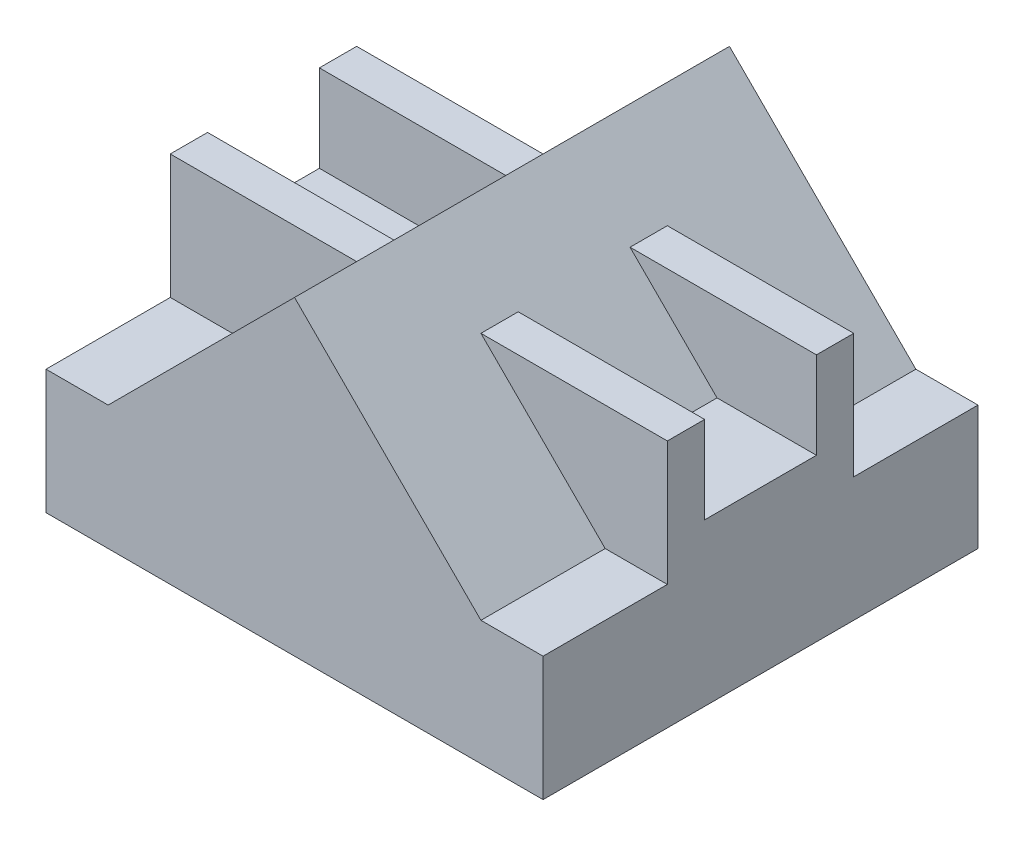
ISO-10303-21;
HEADER;
FILE_DESCRIPTION(('STEP AP214'),'2;1');
FILE_NAME('part.step','',(''),(''),'','','');
FILE_SCHEMA(('AUTOMOTIVE_DESIGN { 1 0 10303 214 1 1 1 1 }'));
ENDSEC;
DATA;
#1=APPLICATION_CONTEXT('core data for automotive mechanical design processes');
#2=APPLICATION_PROTOCOL_DEFINITION('international standard','automotive_design',2000,#1);
#3=PRODUCT_CONTEXT('',#1,'mechanical');
#4=PRODUCT('Part','Part','',(#3));
#5=PRODUCT_RELATED_PRODUCT_CATEGORY('part','',(#4));
#6=PRODUCT_DEFINITION_FORMATION('','',#4);
#7=PRODUCT_DEFINITION_CONTEXT('part definition',#1,'design');
#8=PRODUCT_DEFINITION('design','',#6,#7);
#9=PRODUCT_DEFINITION_SHAPE('','',#8);
#10=(LENGTH_UNIT() NAMED_UNIT(*) SI_UNIT(.MILLI.,.METRE.));
#11=(NAMED_UNIT(*) PLANE_ANGLE_UNIT() SI_UNIT($,.RADIAN.));
#12=(NAMED_UNIT(*) SI_UNIT($,.STERADIAN.) SOLID_ANGLE_UNIT());
#13=UNCERTAINTY_MEASURE_WITH_UNIT(LENGTH_MEASURE(1.E-05),#10,'distance_accuracy_value','');
#14=(GEOMETRIC_REPRESENTATION_CONTEXT(3) GLOBAL_UNCERTAINTY_ASSIGNED_CONTEXT((#13)) GLOBAL_UNIT_ASSIGNED_CONTEXT((#10,
#11,#12)) REPRESENTATION_CONTEXT('',''));
#15=CARTESIAN_POINT('',(0.,0.,0.));
#16=DIRECTION('',(0.,0.,1.));
#17=DIRECTION('',(1.,0.,0.));
#18=AXIS2_PLACEMENT_3D('',#15,#16,#17);
#19=CARTESIAN_POINT('',(-100.,100.,87.5));
#20=DIRECTION('',(1.,0.,0.));
#21=DIRECTION('',(0.,1.,0.));
#22=AXIS2_PLACEMENT_3D('',#19,#20,#21);
#23=PLANE('',#22);
#24=DIRECTION('',(0.,-1.,0.));
#25=VECTOR('',#24,1.);
#26=CARTESIAN_POINT('',(-100.,100.,37.5));
#27=LINE('',#26,#25);
#28=CARTESIAN_POINT('',(-100.,100.,37.5));
#29=VERTEX_POINT('',#28);
#30=CARTESIAN_POINT('',(-100.,50.,37.5));
#31=VERTEX_POINT('',#30);
#32=EDGE_CURVE('E233',#29,#31,#27,.T.);
#33=ORIENTED_EDGE('',*,*,#32,.F.);
#34=DIRECTION('',(0.,0.,-1.));
#35=VECTOR('',#34,1.);
#36=CARTESIAN_POINT('',(-100.,100.,87.5));
#37=LINE('',#36,#35);
#38=CARTESIAN_POINT('',(-100.,100.,22.5));
#39=VERTEX_POINT('',#38);
#40=EDGE_CURVE('E405',#29,#39,#37,.T.);
#41=ORIENTED_EDGE('',*,*,#40,.T.);
#42=DIRECTION('',(0.,1.,0.));
#43=VECTOR('',#42,1.);
#44=CARTESIAN_POINT('',(-100.,65.,22.5));
#45=LINE('',#44,#43);
#46=CARTESIAN_POINT('',(-100.,65.,22.5));
#47=VERTEX_POINT('',#46);
#48=EDGE_CURVE('E226',#47,#39,#45,.T.);
#49=ORIENTED_EDGE('',*,*,#48,.F.);
#50=DIRECTION('',(0.,0.,1.));
#51=VECTOR('',#50,1.);
#52=CARTESIAN_POINT('',(-100.,65.,-22.5));
#53=LINE('',#52,#51);
#54=CARTESIAN_POINT('',(-100.,65.,-22.5));
#55=VERTEX_POINT('',#54);
#56=EDGE_CURVE('E206',#55,#47,#53,.T.);
#57=ORIENTED_EDGE('',*,*,#56,.F.);
#58=DIRECTION('',(0.,-1.,0.));
#59=VECTOR('',#58,1.);
#60=CARTESIAN_POINT('',(-100.,100.,-22.5));
#61=LINE('',#60,#59);
#62=CARTESIAN_POINT('',(-100.,100.,-22.5));
#63=VERTEX_POINT('',#62);
#64=EDGE_CURVE('E214',#63,#55,#61,.T.);
#65=ORIENTED_EDGE('',*,*,#64,.F.);
#66=CARTESIAN_POINT('',(-100.,100.,-37.5));
#67=VERTEX_POINT('',#66);
#68=EDGE_CURVE('E384',#63,#67,#37,.T.);
#69=ORIENTED_EDGE('',*,*,#68,.T.);
#70=DIRECTION('',(0.,1.,0.));
#71=VECTOR('',#70,1.);
#72=CARTESIAN_POINT('',(-100.,50.,-37.5));
#73=LINE('',#72,#71);
#74=CARTESIAN_POINT('',(-100.,50.,-37.5));
#75=VERTEX_POINT('',#74);
#76=EDGE_CURVE('E224',#75,#67,#73,.T.);
#77=ORIENTED_EDGE('',*,*,#76,.F.);
#78=DIRECTION('',(0.,0.,1.));
#79=VECTOR('',#78,1.);
#80=CARTESIAN_POINT('',(-100.,50.,-87.5));
#81=LINE('',#80,#79);
#82=CARTESIAN_POINT('',(-100.,50.,-87.5));
#83=VERTEX_POINT('',#82);
#84=EDGE_CURVE('E451',#83,#75,#81,.T.);
#85=ORIENTED_EDGE('',*,*,#84,.F.);
#86=DIRECTION('',(0.,-1.,0.));
#87=VECTOR('',#86,1.);
#88=CARTESIAN_POINT('',(-100.,100.,-87.5));
#89=LINE('',#88,#87);
#90=CARTESIAN_POINT('',(-100.,0.,-87.5));
#91=VERTEX_POINT('',#90);
#92=EDGE_CURVE('E350',#83,#91,#89,.T.);
#93=ORIENTED_EDGE('',*,*,#92,.T.);
#94=DIRECTION('',(0.,0.,-1.));
#95=VECTOR('',#94,1.);
#96=CARTESIAN_POINT('',(-100.,0.,87.5));
#97=LINE('',#96,#95);
#98=CARTESIAN_POINT('',(-100.,0.,87.5));
#99=VERTEX_POINT('',#98);
#100=EDGE_CURVE('E11',#99,#91,#97,.T.);
#101=ORIENTED_EDGE('',*,*,#100,.F.);
#102=DIRECTION('',(0.,-1.,0.));
#103=VECTOR('',#102,1.);
#104=CARTESIAN_POINT('',(-100.,100.,87.5));
#105=LINE('',#104,#103);
#106=CARTESIAN_POINT('',(-100.,50.,87.5));
#107=VERTEX_POINT('',#106);
#108=EDGE_CURVE('E366',#107,#99,#105,.T.);
#109=ORIENTED_EDGE('',*,*,#108,.F.);
#110=DIRECTION('',(0.,0.,1.));
#111=VECTOR('',#110,1.);
#112=CARTESIAN_POINT('',(-100.,50.,37.5));
#113=LINE('',#112,#111);
#114=EDGE_CURVE('E460',#31,#107,#113,.T.);
#115=ORIENTED_EDGE('',*,*,#114,.F.);
#116=EDGE_LOOP('',(#33,#41,#49,#57,#65,#69,#77,#85,#93,#101,#109,#115));
#117=FACE_BOUND('',#116,.T.);
#118=ADVANCED_FACE('F44',(#117),#23,.F.);
#119=CARTESIAN_POINT('',(-24.9999999999999,100.,87.5));
#120=DIRECTION('',(0.,-1.,0.));
#121=DIRECTION('',(1.,0.,0.));
#122=AXIS2_PLACEMENT_3D('',#119,#120,#121);
#123=PLANE('',#122);
#124=DIRECTION('',(0.,0.,-1.));
#125=VECTOR('',#124,1.);
#126=CARTESIAN_POINT('',(-24.9999999999999,100.,87.5));
#127=LINE('',#126,#125);
#128=CARTESIAN_POINT('',(-24.9999999999999,100.,37.5));
#129=VERTEX_POINT('',#128);
#130=CARTESIAN_POINT('',(-24.9999999999999,100.,22.5));
#131=VERTEX_POINT('',#130);
#132=EDGE_CURVE('E406',#129,#131,#127,.T.);
#133=ORIENTED_EDGE('',*,*,#132,.T.);
#134=DIRECTION('',(-1.,0.,0.));
#135=VECTOR('',#134,1.);
#136=CARTESIAN_POINT('',(192.326284001661,100.,22.5));
#137=LINE('',#136,#135);
#138=EDGE_CURVE('E240',#131,#39,#137,.T.);
#139=ORIENTED_EDGE('',*,*,#138,.T.);
#140=ORIENTED_EDGE('',*,*,#40,.F.);
#141=DIRECTION('',(-1.,0.,0.));
#142=VECTOR('',#141,1.);
#143=CARTESIAN_POINT('',(192.326284001661,100.,37.5));
#144=LINE('',#143,#142);
#145=EDGE_CURVE('E257',#129,#29,#144,.T.);
#146=ORIENTED_EDGE('',*,*,#145,.F.);
#147=EDGE_LOOP('',(#133,#139,#140,#146));
#148=FACE_BOUND('',#147,.T.);
#149=ADVANCED_FACE('F485',(#148),#123,.F.);
#150=CARTESIAN_POINT('',(-24.9999999999999,100.,-22.5));
#151=VERTEX_POINT('',#150);
#152=CARTESIAN_POINT('',(-24.9999999999999,100.,-37.5));
#153=VERTEX_POINT('',#152);
#154=EDGE_CURVE('E401',#151,#153,#127,.T.);
#155=ORIENTED_EDGE('',*,*,#154,.T.);
#156=DIRECTION('',(-1.,0.,0.));
#157=VECTOR('',#156,1.);
#158=CARTESIAN_POINT('',(192.326284001661,100.,-37.5));
#159=LINE('',#158,#157);
#160=EDGE_CURVE('E242',#153,#67,#159,.T.);
#161=ORIENTED_EDGE('',*,*,#160,.T.);
#162=ORIENTED_EDGE('',*,*,#68,.F.);
#163=DIRECTION('',(-1.,0.,0.));
#164=VECTOR('',#163,1.);
#165=CARTESIAN_POINT('',(192.326284001661,100.,-22.5));
#166=LINE('',#165,#164);
#167=EDGE_CURVE('E217',#151,#63,#166,.T.);
#168=ORIENTED_EDGE('',*,*,#167,.F.);
#169=EDGE_LOOP('',(#155,#161,#162,#168));
#170=FACE_BOUND('',#169,.T.);
#171=ADVANCED_FACE('F486',(#170),#123,.F.);
#172=CARTESIAN_POINT('',(0.,0.,87.5));
#173=DIRECTION('',(0.,0.,1.));
#174=DIRECTION('',(1.,0.,0.));
#175=AXIS2_PLACEMENT_3D('',#172,#173,#174);
#176=PLANE('',#175);
#177=DIRECTION('',(-0.707106781186546,-0.707106781186549,0.));
#178=VECTOR('',#177,1.);
#179=CARTESIAN_POINT('',(0.,125.,87.5));
#180=LINE('',#179,#178);
#181=CARTESIAN_POINT('',(0.,125.,87.5));
#182=VERTEX_POINT('',#181);
#183=CARTESIAN_POINT('',(-74.9999999999997,50.,87.5));
#184=VERTEX_POINT('',#183);
#185=EDGE_CURVE('E385',#182,#184,#180,.T.);
#186=ORIENTED_EDGE('',*,*,#185,.T.);
#187=DIRECTION('',(-1.,0.,0.));
#188=VECTOR('',#187,1.);
#189=CARTESIAN_POINT('',(192.326284001661,50.,87.5));
#190=LINE('',#189,#188);
#191=EDGE_CURVE('E254',#184,#107,#190,.T.);
#192=ORIENTED_EDGE('',*,*,#191,.T.);
#193=ORIENTED_EDGE('',*,*,#108,.T.);
#194=DIRECTION('',(1.,0.,0.));
#195=VECTOR('',#194,1.);
#196=CARTESIAN_POINT('',(-100.,0.,87.5));
#197=LINE('',#196,#195);
#198=CARTESIAN_POINT('',(100.,0.,87.5));
#199=VERTEX_POINT('',#198);
#200=EDGE_CURVE('E371',#99,#199,#197,.T.);
#201=ORIENTED_EDGE('',*,*,#200,.T.);
#202=DIRECTION('',(0.,1.,0.));
#203=VECTOR('',#202,1.);
#204=CARTESIAN_POINT('',(100.,0.,87.5));
#205=LINE('',#204,#203);
#206=CARTESIAN_POINT('',(100.,50.,87.5));
#207=VERTEX_POINT('',#206);
#208=EDGE_CURVE('E374',#199,#207,#205,.T.);
#209=ORIENTED_EDGE('',*,*,#208,.T.);
#210=DIRECTION('',(1.,0.,0.));
#211=VECTOR('',#210,1.);
#212=CARTESIAN_POINT('',(-192.326284001661,50.,87.5));
#213=LINE('',#212,#211);
#214=CARTESIAN_POINT('',(74.9999999999997,50.,87.5));
#215=VERTEX_POINT('',#214);
#216=EDGE_CURVE('E290',#215,#207,#213,.T.);
#217=ORIENTED_EDGE('',*,*,#216,.F.);
#218=DIRECTION('',(-0.707106781186546,0.707106781186549,0.));
#219=VECTOR('',#218,1.);
#220=CARTESIAN_POINT('',(24.9999999999999,100.,87.5));
#221=LINE('',#220,#219);
#222=EDGE_CURVE('E377',#215,#182,#221,.T.);
#223=ORIENTED_EDGE('',*,*,#222,.T.);
#224=EDGE_LOOP('',(#186,#192,#193,#201,#209,#217,#223));
#225=FACE_BOUND('',#224,.T.);
#226=ADVANCED_FACE('F475',(#225),#176,.T.);
#227=CARTESIAN_POINT('',(0.,0.,-87.5));
#228=DIRECTION('',(0.,0.,1.));
#229=DIRECTION('',(1.,0.,0.));
#230=AXIS2_PLACEMENT_3D('',#227,#228,#229);
#231=PLANE('',#230);
#232=DIRECTION('',(-1.,0.,0.));
#233=VECTOR('',#232,1.);
#234=CARTESIAN_POINT('',(192.326284001661,50.,-87.5));
#235=LINE('',#234,#233);
#236=CARTESIAN_POINT('',(-74.9999999999997,50.,-87.5));
#237=VERTEX_POINT('',#236);
#238=EDGE_CURVE('E249',#237,#83,#235,.T.);
#239=ORIENTED_EDGE('',*,*,#238,.F.);
#240=DIRECTION('',(-0.707106781186546,-0.707106781186549,0.));
#241=VECTOR('',#240,1.);
#242=CARTESIAN_POINT('',(0.,125.,-87.5));
#243=LINE('',#242,#241);
#244=CARTESIAN_POINT('',(0.,125.,-87.5));
#245=VERTEX_POINT('',#244);
#246=EDGE_CURVE('E375',#245,#237,#243,.T.);
#247=ORIENTED_EDGE('',*,*,#246,.F.);
#248=DIRECTION('',(-0.707106781186546,0.707106781186549,0.));
#249=VECTOR('',#248,1.);
#250=CARTESIAN_POINT('',(24.9999999999999,100.,-87.5));
#251=LINE('',#250,#249);
#252=CARTESIAN_POINT('',(74.9999999999997,50.,-87.5));
#253=VERTEX_POINT('',#252);
#254=EDGE_CURVE('E392',#253,#245,#251,.T.);
#255=ORIENTED_EDGE('',*,*,#254,.F.);
#256=DIRECTION('',(1.,0.,0.));
#257=VECTOR('',#256,1.);
#258=CARTESIAN_POINT('',(-192.326284001661,50.,-87.5));
#259=LINE('',#258,#257);
#260=CARTESIAN_POINT('',(100.,50.,-87.5));
#261=VERTEX_POINT('',#260);
#262=EDGE_CURVE('E311',#253,#261,#259,.T.);
#263=ORIENTED_EDGE('',*,*,#262,.T.);
#264=DIRECTION('',(0.,1.,0.));
#265=VECTOR('',#264,1.);
#266=CARTESIAN_POINT('',(100.,0.,-87.5));
#267=LINE('',#266,#265);
#268=CARTESIAN_POINT('',(100.,0.,-87.5));
#269=VERTEX_POINT('',#268);
#270=EDGE_CURVE('E394',#269,#261,#267,.T.);
#271=ORIENTED_EDGE('',*,*,#270,.F.);
#272=DIRECTION('',(1.,0.,0.));
#273=VECTOR('',#272,1.);
#274=CARTESIAN_POINT('',(-100.,0.,-87.5));
#275=LINE('',#274,#273);
#276=EDGE_CURVE('E389',#91,#269,#275,.T.);
#277=ORIENTED_EDGE('',*,*,#276,.F.);
#278=ORIENTED_EDGE('',*,*,#92,.F.);
#279=EDGE_LOOP('',(#239,#247,#255,#263,#271,#277,#278));
#280=FACE_BOUND('',#279,.T.);
#281=ADVANCED_FACE('F499',(#280),#231,.F.);
#282=CARTESIAN_POINT('',(100.,0.,87.5));
#283=DIRECTION('',(-1.,0.,0.));
#284=DIRECTION('',(0.,-1.,0.));
#285=AXIS2_PLACEMENT_3D('',#282,#283,#284);
#286=PLANE('',#285);
#287=DIRECTION('',(0.,0.,-1.));
#288=VECTOR('',#287,1.);
#289=CARTESIAN_POINT('',(100.,50.,87.5));
#290=LINE('',#289,#288);
#291=CARTESIAN_POINT('',(100.,50.,37.5));
#292=VERTEX_POINT('',#291);
#293=EDGE_CURVE('E285',#207,#292,#290,.T.);
#294=ORIENTED_EDGE('',*,*,#293,.F.);
#295=ORIENTED_EDGE('',*,*,#208,.F.);
#296=DIRECTION('',(0.,0.,-1.));
#297=VECTOR('',#296,1.);
#298=CARTESIAN_POINT('',(100.,0.,87.5));
#299=LINE('',#298,#297);
#300=EDGE_CURVE('E52',#199,#269,#299,.T.);
#301=ORIENTED_EDGE('',*,*,#300,.T.);
#302=ORIENTED_EDGE('',*,*,#270,.T.);
#303=DIRECTION('',(0.,0.,-1.));
#304=VECTOR('',#303,1.);
#305=CARTESIAN_POINT('',(100.,50.,-37.5));
#306=LINE('',#305,#304);
#307=CARTESIAN_POINT('',(100.,50.,-37.5));
#308=VERTEX_POINT('',#307);
#309=EDGE_CURVE('E283',#308,#261,#306,.T.);
#310=ORIENTED_EDGE('',*,*,#309,.F.);
#311=DIRECTION('',(0.,-1.,0.));
#312=VECTOR('',#311,1.);
#313=CARTESIAN_POINT('',(100.,100.,-37.5));
#314=LINE('',#313,#312);
#315=CARTESIAN_POINT('',(100.,100.,-37.5));
#316=VERTEX_POINT('',#315);
#317=EDGE_CURVE('E286',#316,#308,#314,.T.);
#318=ORIENTED_EDGE('',*,*,#317,.F.);
#319=DIRECTION('',(0.,0.,-1.));
#320=VECTOR('',#319,1.);
#321=CARTESIAN_POINT('',(100.,100.,87.5));
#322=LINE('',#321,#320);
#323=CARTESIAN_POINT('',(100.,100.,-22.5));
#324=VERTEX_POINT('',#323);
#325=EDGE_CURVE('E417',#324,#316,#322,.T.);
#326=ORIENTED_EDGE('',*,*,#325,.F.);
#327=DIRECTION('',(0.,1.,0.));
#328=VECTOR('',#327,1.);
#329=CARTESIAN_POINT('',(100.,65.,-22.5));
#330=LINE('',#329,#328);
#331=CARTESIAN_POINT('',(100.,65.,-22.5));
#332=VERTEX_POINT('',#331);
#333=EDGE_CURVE('E295',#332,#324,#330,.T.);
#334=ORIENTED_EDGE('',*,*,#333,.F.);
#335=DIRECTION('',(0.,0.,-1.));
#336=VECTOR('',#335,1.);
#337=CARTESIAN_POINT('',(100.,65.,22.5));
#338=LINE('',#337,#336);
#339=CARTESIAN_POINT('',(100.,65.,22.5));
#340=VERTEX_POINT('',#339);
#341=EDGE_CURVE('E293',#340,#332,#338,.T.);
#342=ORIENTED_EDGE('',*,*,#341,.F.);
#343=DIRECTION('',(0.,-1.,0.));
#344=VECTOR('',#343,1.);
#345=CARTESIAN_POINT('',(100.,100.,22.5));
#346=LINE('',#345,#344);
#347=CARTESIAN_POINT('',(100.,100.,22.5));
#348=VERTEX_POINT('',#347);
#349=EDGE_CURVE('E298',#348,#340,#346,.T.);
#350=ORIENTED_EDGE('',*,*,#349,.F.);
#351=CARTESIAN_POINT('',(100.,100.,37.5));
#352=VERTEX_POINT('',#351);
#353=EDGE_CURVE('E419',#352,#348,#322,.T.);
#354=ORIENTED_EDGE('',*,*,#353,.F.);
#355=DIRECTION('',(0.,1.,0.));
#356=VECTOR('',#355,1.);
#357=CARTESIAN_POINT('',(100.,50.,37.5));
#358=LINE('',#357,#356);
#359=EDGE_CURVE('E301',#292,#352,#358,.T.);
#360=ORIENTED_EDGE('',*,*,#359,.F.);
#361=EDGE_LOOP('',(#294,#295,#301,#302,#310,#318,#326,#334,#342,#350,#354,#360));
#362=FACE_BOUND('',#361,.T.);
#363=ADVANCED_FACE('F438',(#362),#286,.F.);
#364=CARTESIAN_POINT('',(100.,100.,87.5));
#365=DIRECTION('',(0.,-1.,0.));
#366=DIRECTION('',(1.,0.,0.));
#367=AXIS2_PLACEMENT_3D('',#364,#365,#366);
#368=PLANE('',#367);
#369=DIRECTION('',(0.,0.,-1.));
#370=VECTOR('',#369,1.);
#371=CARTESIAN_POINT('',(24.9999999999999,100.,87.5));
#372=LINE('',#371,#370);
#373=CARTESIAN_POINT('',(24.9999999999999,100.,37.5));
#374=VERTEX_POINT('',#373);
#375=CARTESIAN_POINT('',(24.9999999999999,100.,22.5));
#376=VERTEX_POINT('',#375);
#377=EDGE_CURVE('E418',#374,#376,#372,.T.);
#378=ORIENTED_EDGE('',*,*,#377,.F.);
#379=DIRECTION('',(1.,0.,0.));
#380=VECTOR('',#379,1.);
#381=CARTESIAN_POINT('',(-192.326284001661,100.,37.5));
#382=LINE('',#381,#380);
#383=EDGE_CURVE('E340',#374,#352,#382,.T.);
#384=ORIENTED_EDGE('',*,*,#383,.T.);
#385=ORIENTED_EDGE('',*,*,#353,.T.);
#386=DIRECTION('',(1.,0.,0.));
#387=VECTOR('',#386,1.);
#388=CARTESIAN_POINT('',(-192.326284001661,100.,22.5));
#389=LINE('',#388,#387);
#390=EDGE_CURVE('E331',#376,#348,#389,.T.);
#391=ORIENTED_EDGE('',*,*,#390,.F.);
#392=EDGE_LOOP('',(#378,#384,#385,#391));
#393=FACE_BOUND('',#392,.T.);
#394=ADVANCED_FACE('F433',(#393),#368,.F.);
#395=CARTESIAN_POINT('',(24.9999999999999,100.,-22.5));
#396=VERTEX_POINT('',#395);
#397=CARTESIAN_POINT('',(24.9999999999999,100.,-37.5));
#398=VERTEX_POINT('',#397);
#399=EDGE_CURVE('E415',#396,#398,#372,.T.);
#400=ORIENTED_EDGE('',*,*,#399,.F.);
#401=DIRECTION('',(1.,0.,0.));
#402=VECTOR('',#401,1.);
#403=CARTESIAN_POINT('',(-192.326284001661,100.,-22.5));
#404=LINE('',#403,#402);
#405=EDGE_CURVE('E323',#396,#324,#404,.T.);
#406=ORIENTED_EDGE('',*,*,#405,.T.);
#407=ORIENTED_EDGE('',*,*,#325,.T.);
#408=DIRECTION('',(1.,0.,0.));
#409=VECTOR('',#408,1.);
#410=CARTESIAN_POINT('',(-192.326284001661,100.,-37.5));
#411=LINE('',#410,#409);
#412=EDGE_CURVE('E317',#398,#316,#411,.T.);
#413=ORIENTED_EDGE('',*,*,#412,.F.);
#414=EDGE_LOOP('',(#400,#406,#407,#413));
#415=FACE_BOUND('',#414,.T.);
#416=ADVANCED_FACE('F516',(#415),#368,.F.);
#417=CARTESIAN_POINT('',(-100.,0.,87.5));
#418=DIRECTION('',(0.,1.,0.));
#419=DIRECTION('',(-1.,0.,0.));
#420=AXIS2_PLACEMENT_3D('',#417,#418,#419);
#421=PLANE('',#420);
#422=ORIENTED_EDGE('',*,*,#276,.T.);
#423=ORIENTED_EDGE('',*,*,#300,.F.);
#424=ORIENTED_EDGE('',*,*,#200,.F.);
#425=ORIENTED_EDGE('',*,*,#100,.T.);
#426=EDGE_LOOP('',(#422,#423,#424,#425));
#427=FACE_BOUND('',#426,.T.);
#428=ADVANCED_FACE('F504',(#427),#421,.F.);
#429=CARTESIAN_POINT('',(24.9999999999999,100.,87.5));
#430=DIRECTION('',(-0.707106781186549,-0.707106781186546,0.));
#431=DIRECTION('',(0.707106781186546,-0.707106781186549,0.));
#432=AXIS2_PLACEMENT_3D('',#429,#430,#431);
#433=PLANE('',#432);
#434=ORIENTED_EDGE('',*,*,#254,.T.);
#435=DIRECTION('',(0.,0.,-1.));
#436=VECTOR('',#435,1.);
#437=CARTESIAN_POINT('',(0.,125.,87.5));
#438=LINE('',#437,#436);
#439=EDGE_CURVE('E410',#182,#245,#438,.T.);
#440=ORIENTED_EDGE('',*,*,#439,.F.);
#441=ORIENTED_EDGE('',*,*,#222,.F.);
#442=DIRECTION('',(0.,0.,-1.));
#443=VECTOR('',#442,1.);
#444=CARTESIAN_POINT('',(74.9999999999997,50.,87.4999999999999));
#445=LINE('',#444,#443);
#446=CARTESIAN_POINT('',(74.9999999999997,50.,37.5));
#447=VERTEX_POINT('',#446);
#448=EDGE_CURVE('E337',#215,#447,#445,.T.);
#449=ORIENTED_EDGE('',*,*,#448,.T.);
#450=DIRECTION('',(-0.707106781186546,0.707106781186549,0.));
#451=VECTOR('',#450,1.);
#452=CARTESIAN_POINT('',(-58.6631420008303,183.66314200083,37.5));
#453=LINE('',#452,#451);
#454=EDGE_CURVE('E333',#447,#374,#453,.T.);
#455=ORIENTED_EDGE('',*,*,#454,.T.);
#456=ORIENTED_EDGE('',*,*,#377,.T.);
#457=DIRECTION('',(0.707106781186546,-0.707106781186549,0.));
#458=VECTOR('',#457,1.);
#459=CARTESIAN_POINT('',(-83.6631420008303,208.663142000831,22.5));
#460=LINE('',#459,#458);
#461=CARTESIAN_POINT('',(59.9999999999998,65.,22.5));
#462=VERTEX_POINT('',#461);
#463=EDGE_CURVE('E329',#376,#462,#460,.T.);
#464=ORIENTED_EDGE('',*,*,#463,.T.);
#465=DIRECTION('',(0.,0.,-1.));
#466=VECTOR('',#465,1.);
#467=CARTESIAN_POINT('',(59.9999999999997,65.,22.5));
#468=LINE('',#467,#466);
#469=CARTESIAN_POINT('',(59.9999999999997,65.,-22.5));
#470=VERTEX_POINT('',#469);
#471=EDGE_CURVE('E324',#462,#470,#468,.T.);
#472=ORIENTED_EDGE('',*,*,#471,.T.);
#473=DIRECTION('',(-0.707106781186546,0.707106781186549,0.));
#474=VECTOR('',#473,1.);
#475=CARTESIAN_POINT('',(-66.1631420008303,191.163142000831,-22.5));
#476=LINE('',#475,#474);
#477=EDGE_CURVE('E319',#470,#396,#476,.T.);
#478=ORIENTED_EDGE('',*,*,#477,.T.);
#479=ORIENTED_EDGE('',*,*,#399,.T.);
#480=DIRECTION('',(0.707106781186546,-0.707106781186549,0.));
#481=VECTOR('',#480,1.);
#482=CARTESIAN_POINT('',(-83.6631420008303,208.663142000831,-37.5));
#483=LINE('',#482,#481);
#484=CARTESIAN_POINT('',(74.9999999999997,50.,-37.5));
#485=VERTEX_POINT('',#484);
#486=EDGE_CURVE('E312',#398,#485,#483,.T.);
#487=ORIENTED_EDGE('',*,*,#486,.T.);
#488=DIRECTION('',(0.,0.,-1.));
#489=VECTOR('',#488,1.);
#490=CARTESIAN_POINT('',(74.9999999999997,50.,-37.5));
#491=LINE('',#490,#489);
#492=EDGE_CURVE('E310',#485,#253,#491,.T.);
#493=ORIENTED_EDGE('',*,*,#492,.T.);
#494=EDGE_LOOP('',(#434,#440,#441,#449,#455,#456,#464,#472,#478,#479,#487,#493));
#495=FACE_BOUND('',#494,.T.);
#496=ADVANCED_FACE('F449',(#495),#433,.F.);
#497=CARTESIAN_POINT('',(0.,125.,87.5));
#498=DIRECTION('',(0.707106781186549,-0.707106781186546,0.));
#499=DIRECTION('',(0.707106781186546,0.707106781186549,0.));
#500=AXIS2_PLACEMENT_3D('',#497,#498,#499);
#501=PLANE('',#500);
#502=ORIENTED_EDGE('',*,*,#246,.T.);
#503=DIRECTION('',(0.,0.,1.));
#504=VECTOR('',#503,1.);
#505=CARTESIAN_POINT('',(-74.9999999999997,50.,-87.5));
#506=LINE('',#505,#504);
#507=CARTESIAN_POINT('',(-74.9999999999997,50.,-37.5));
#508=VERTEX_POINT('',#507);
#509=EDGE_CURVE('E250',#237,#508,#506,.T.);
#510=ORIENTED_EDGE('',*,*,#509,.T.);
#511=DIRECTION('',(0.707106781186546,0.707106781186549,0.));
#512=VECTOR('',#511,1.);
#513=CARTESIAN_POINT('',(58.6631420008303,183.663142000831,-37.5));
#514=LINE('',#513,#512);
#515=EDGE_CURVE('E58',#508,#153,#514,.T.);
#516=ORIENTED_EDGE('',*,*,#515,.T.);
#517=ORIENTED_EDGE('',*,*,#154,.F.);
#518=DIRECTION('',(-0.707106781186546,-0.707106781186549,0.));
#519=VECTOR('',#518,1.);
#520=CARTESIAN_POINT('',(83.6631420008303,208.663142000831,-22.5));
#521=LINE('',#520,#519);
#522=CARTESIAN_POINT('',(-59.9999999999997,65.,-22.5));
#523=VERTEX_POINT('',#522);
#524=EDGE_CURVE('E215',#151,#523,#521,.T.);
#525=ORIENTED_EDGE('',*,*,#524,.T.);
#526=DIRECTION('',(0.,0.,1.));
#527=VECTOR('',#526,1.);
#528=CARTESIAN_POINT('',(-59.9999999999997,65.,-22.5));
#529=LINE('',#528,#527);
#530=CARTESIAN_POINT('',(-59.9999999999997,65.,22.5));
#531=VERTEX_POINT('',#530);
#532=EDGE_CURVE('E208',#523,#531,#529,.T.);
#533=ORIENTED_EDGE('',*,*,#532,.T.);
#534=DIRECTION('',(0.707106781186546,0.707106781186549,0.));
#535=VECTOR('',#534,1.);
#536=CARTESIAN_POINT('',(66.1631420008303,191.163142000831,22.5));
#537=LINE('',#536,#535);
#538=EDGE_CURVE('E70',#531,#131,#537,.T.);
#539=ORIENTED_EDGE('',*,*,#538,.T.);
#540=ORIENTED_EDGE('',*,*,#132,.F.);
#541=DIRECTION('',(-0.707106781186546,-0.707106781186549,0.));
#542=VECTOR('',#541,1.);
#543=CARTESIAN_POINT('',(83.6631420008303,208.663142000831,37.5));
#544=LINE('',#543,#542);
#545=CARTESIAN_POINT('',(-74.9999999999997,50.,37.5));
#546=VERTEX_POINT('',#545);
#547=EDGE_CURVE('E260',#129,#546,#544,.T.);
#548=ORIENTED_EDGE('',*,*,#547,.T.);
#549=DIRECTION('',(0.,0.,1.));
#550=VECTOR('',#549,1.);
#551=CARTESIAN_POINT('',(-74.9999999999997,50.,37.4999999999999));
#552=LINE('',#551,#550);
#553=EDGE_CURVE('E253',#546,#184,#552,.T.);
#554=ORIENTED_EDGE('',*,*,#553,.T.);
#555=ORIENTED_EDGE('',*,*,#185,.F.);
#556=ORIENTED_EDGE('',*,*,#439,.T.);
#557=EDGE_LOOP('',(#502,#510,#516,#517,#525,#533,#539,#540,#548,#554,#555,#556));
#558=FACE_BOUND('',#557,.T.);
#559=ADVANCED_FACE('F479',(#558),#501,.F.);
#560=CARTESIAN_POINT('',(-192.326284001661,50.,-37.5));
#561=DIRECTION('',(0.,-1.,0.));
#562=DIRECTION('',(1.,0.,0.));
#563=AXIS2_PLACEMENT_3D('',#560,#561,#562);
#564=PLANE('',#563);
#565=DIRECTION('',(1.,0.,0.));
#566=VECTOR('',#565,1.);
#567=CARTESIAN_POINT('',(-192.326284001661,50.,-37.5));
#568=LINE('',#567,#566);
#569=EDGE_CURVE('E314',#485,#308,#568,.T.);
#570=ORIENTED_EDGE('',*,*,#569,.T.);
#571=ORIENTED_EDGE('',*,*,#309,.T.);
#572=ORIENTED_EDGE('',*,*,#262,.F.);
#573=ORIENTED_EDGE('',*,*,#492,.F.);
#574=EDGE_LOOP('',(#570,#571,#572,#573));
#575=FACE_BOUND('',#574,.T.);
#576=ADVANCED_FACE('F506',(#575),#564,.F.);
#577=CARTESIAN_POINT('',(-192.326284001661,100.,-37.5));
#578=DIRECTION('',(0.,0.,1.));
#579=DIRECTION('',(0.,-1.,0.));
#580=AXIS2_PLACEMENT_3D('',#577,#578,#579);
#581=PLANE('',#580);
#582=ORIENTED_EDGE('',*,*,#412,.T.);
#583=ORIENTED_EDGE('',*,*,#317,.T.);
#584=ORIENTED_EDGE('',*,*,#569,.F.);
#585=ORIENTED_EDGE('',*,*,#486,.F.);
#586=EDGE_LOOP('',(#582,#583,#584,#585));
#587=FACE_BOUND('',#586,.T.);
#588=ADVANCED_FACE('F524',(#587),#581,.F.);
#589=CARTESIAN_POINT('',(-192.326284001661,65.,22.5));
#590=DIRECTION('',(0.,-1.,0.));
#591=DIRECTION('',(1.,0.,0.));
#592=AXIS2_PLACEMENT_3D('',#589,#590,#591);
#593=PLANE('',#592);
#594=DIRECTION('',(1.,0.,0.));
#595=VECTOR('',#594,1.);
#596=CARTESIAN_POINT('',(-192.326284001661,65.,22.5));
#597=LINE('',#596,#595);
#598=EDGE_CURVE('E328',#462,#340,#597,.T.);
#599=ORIENTED_EDGE('',*,*,#598,.T.);
#600=ORIENTED_EDGE('',*,*,#341,.T.);
#601=DIRECTION('',(1.,0.,0.));
#602=VECTOR('',#601,1.);
#603=CARTESIAN_POINT('',(-192.326284001661,65.,-22.5));
#604=LINE('',#603,#602);
#605=EDGE_CURVE('E322',#470,#332,#604,.T.);
#606=ORIENTED_EDGE('',*,*,#605,.F.);
#607=ORIENTED_EDGE('',*,*,#471,.F.);
#608=EDGE_LOOP('',(#599,#600,#606,#607));
#609=FACE_BOUND('',#608,.T.);
#610=ADVANCED_FACE('F521',(#609),#593,.F.);
#611=CARTESIAN_POINT('',(-192.326284001661,65.,-22.5));
#612=DIRECTION('',(0.,0.,-1.));
#613=DIRECTION('',(-1.,0.,0.));
#614=AXIS2_PLACEMENT_3D('',#611,#612,#613);
#615=PLANE('',#614);
#616=ORIENTED_EDGE('',*,*,#605,.T.);
#617=ORIENTED_EDGE('',*,*,#333,.T.);
#618=ORIENTED_EDGE('',*,*,#405,.F.);
#619=ORIENTED_EDGE('',*,*,#477,.F.);
#620=EDGE_LOOP('',(#616,#617,#618,#619));
#621=FACE_BOUND('',#620,.T.);
#622=ADVANCED_FACE('F517',(#621),#615,.F.);
#623=CARTESIAN_POINT('',(-192.326284001661,100.,22.5));
#624=DIRECTION('',(0.,0.,1.));
#625=DIRECTION('',(0.,-1.,0.));
#626=AXIS2_PLACEMENT_3D('',#623,#624,#625);
#627=PLANE('',#626);
#628=ORIENTED_EDGE('',*,*,#390,.T.);
#629=ORIENTED_EDGE('',*,*,#349,.T.);
#630=ORIENTED_EDGE('',*,*,#598,.F.);
#631=ORIENTED_EDGE('',*,*,#463,.F.);
#632=EDGE_LOOP('',(#628,#629,#630,#631));
#633=FACE_BOUND('',#632,.T.);
#634=ADVANCED_FACE('F441',(#633),#627,.F.);
#635=CARTESIAN_POINT('',(-192.326284001661,50.,87.5));
#636=DIRECTION('',(0.,-1.,0.));
#637=DIRECTION('',(0.,0.,-1.));
#638=AXIS2_PLACEMENT_3D('',#635,#636,#637);
#639=PLANE('',#638);
#640=ORIENTED_EDGE('',*,*,#216,.T.);
#641=ORIENTED_EDGE('',*,*,#293,.T.);
#642=DIRECTION('',(1.,0.,0.));
#643=VECTOR('',#642,1.);
#644=CARTESIAN_POINT('',(-192.326284001661,50.,37.5));
#645=LINE('',#644,#643);
#646=EDGE_CURVE('E338',#447,#292,#645,.T.);
#647=ORIENTED_EDGE('',*,*,#646,.F.);
#648=ORIENTED_EDGE('',*,*,#448,.F.);
#649=EDGE_LOOP('',(#640,#641,#647,#648));
#650=FACE_BOUND('',#649,.T.);
#651=ADVANCED_FACE('F503',(#650),#639,.F.);
#652=CARTESIAN_POINT('',(-192.326284001661,50.,37.5));
#653=DIRECTION('',(0.,0.,-1.));
#654=DIRECTION('',(-1.,0.,0.));
#655=AXIS2_PLACEMENT_3D('',#652,#653,#654);
#656=PLANE('',#655);
#657=ORIENTED_EDGE('',*,*,#646,.T.);
#658=ORIENTED_EDGE('',*,*,#359,.T.);
#659=ORIENTED_EDGE('',*,*,#383,.F.);
#660=ORIENTED_EDGE('',*,*,#454,.F.);
#661=EDGE_LOOP('',(#657,#658,#659,#660));
#662=FACE_BOUND('',#661,.T.);
#663=ADVANCED_FACE('F607',(#662),#656,.F.);
#664=CARTESIAN_POINT('',(192.326284001661,50.,37.5));
#665=DIRECTION('',(0.,-1.,0.));
#666=DIRECTION('',(0.,0.,-1.));
#667=AXIS2_PLACEMENT_3D('',#664,#665,#666);
#668=PLANE('',#667);
#669=DIRECTION('',(-1.,0.,0.));
#670=VECTOR('',#669,1.);
#671=CARTESIAN_POINT('',(192.326284001661,50.,37.5));
#672=LINE('',#671,#670);
#673=EDGE_CURVE('E258',#546,#31,#672,.T.);
#674=ORIENTED_EDGE('',*,*,#673,.T.);
#675=ORIENTED_EDGE('',*,*,#114,.T.);
#676=ORIENTED_EDGE('',*,*,#191,.F.);
#677=ORIENTED_EDGE('',*,*,#553,.F.);
#678=EDGE_LOOP('',(#674,#675,#676,#677));
#679=FACE_BOUND('',#678,.T.);
#680=ADVANCED_FACE('F472',(#679),#668,.F.);
#681=CARTESIAN_POINT('',(192.326284001661,100.,37.5));
#682=DIRECTION('',(0.,0.,-1.));
#683=DIRECTION('',(-1.,0.,0.));
#684=AXIS2_PLACEMENT_3D('',#681,#682,#683);
#685=PLANE('',#684);
#686=ORIENTED_EDGE('',*,*,#145,.T.);
#687=ORIENTED_EDGE('',*,*,#32,.T.);
#688=ORIENTED_EDGE('',*,*,#673,.F.);
#689=ORIENTED_EDGE('',*,*,#547,.F.);
#690=EDGE_LOOP('',(#686,#687,#688,#689));
#691=FACE_BOUND('',#690,.T.);
#692=ADVANCED_FACE('F462',(#691),#685,.F.);
#693=CARTESIAN_POINT('',(192.326284001661,65.0000000000001,-22.5));
#694=DIRECTION('',(0.,-1.,0.));
#695=DIRECTION('',(1.,0.,0.));
#696=AXIS2_PLACEMENT_3D('',#693,#694,#695);
#697=PLANE('',#696);
#698=DIRECTION('',(-1.,0.,0.));
#699=VECTOR('',#698,1.);
#700=CARTESIAN_POINT('',(192.326284001661,65.0000000000001,-22.5));
#701=LINE('',#700,#699);
#702=EDGE_CURVE('E203',#523,#55,#701,.T.);
#703=ORIENTED_EDGE('',*,*,#702,.T.);
#704=ORIENTED_EDGE('',*,*,#56,.T.);
#705=DIRECTION('',(-1.,0.,0.));
#706=VECTOR('',#705,1.);
#707=CARTESIAN_POINT('',(192.326284001661,65.0000000000001,22.5));
#708=LINE('',#707,#706);
#709=EDGE_CURVE('E238',#531,#47,#708,.T.);
#710=ORIENTED_EDGE('',*,*,#709,.F.);
#711=ORIENTED_EDGE('',*,*,#532,.F.);
#712=EDGE_LOOP('',(#703,#704,#710,#711));
#713=FACE_BOUND('',#712,.T.);
#714=ADVANCED_FACE('F201',(#713),#697,.F.);
#715=CARTESIAN_POINT('',(192.326284001661,100.,-22.5));
#716=DIRECTION('',(0.,0.,-1.));
#717=DIRECTION('',(-1.,0.,0.));
#718=AXIS2_PLACEMENT_3D('',#715,#716,#717);
#719=PLANE('',#718);
#720=ORIENTED_EDGE('',*,*,#167,.T.);
#721=ORIENTED_EDGE('',*,*,#64,.T.);
#722=ORIENTED_EDGE('',*,*,#702,.F.);
#723=ORIENTED_EDGE('',*,*,#524,.F.);
#724=EDGE_LOOP('',(#720,#721,#722,#723));
#725=FACE_BOUND('',#724,.T.);
#726=ADVANCED_FACE('F216',(#725),#719,.F.);
#727=CARTESIAN_POINT('',(192.326284001661,65.0000000000001,22.5));
#728=DIRECTION('',(0.,0.,1.));
#729=DIRECTION('',(0.,-1.,0.));
#730=AXIS2_PLACEMENT_3D('',#727,#728,#729);
#731=PLANE('',#730);
#732=ORIENTED_EDGE('',*,*,#709,.T.);
#733=ORIENTED_EDGE('',*,*,#48,.T.);
#734=ORIENTED_EDGE('',*,*,#138,.F.);
#735=ORIENTED_EDGE('',*,*,#538,.F.);
#736=EDGE_LOOP('',(#732,#733,#734,#735));
#737=FACE_BOUND('',#736,.T.);
#738=ADVANCED_FACE('F482',(#737),#731,.F.);
#739=CARTESIAN_POINT('',(192.326284001661,50.,-87.5));
#740=DIRECTION('',(0.,-1.,0.));
#741=DIRECTION('',(1.,0.,0.));
#742=AXIS2_PLACEMENT_3D('',#739,#740,#741);
#743=PLANE('',#742);
#744=ORIENTED_EDGE('',*,*,#238,.T.);
#745=ORIENTED_EDGE('',*,*,#84,.T.);
#746=DIRECTION('',(-1.,0.,0.));
#747=VECTOR('',#746,1.);
#748=CARTESIAN_POINT('',(192.326284001661,50.,-37.5));
#749=LINE('',#748,#747);
#750=EDGE_CURVE('E248',#508,#75,#749,.T.);
#751=ORIENTED_EDGE('',*,*,#750,.F.);
#752=ORIENTED_EDGE('',*,*,#509,.F.);
#753=EDGE_LOOP('',(#744,#745,#751,#752));
#754=FACE_BOUND('',#753,.T.);
#755=ADVANCED_FACE('F494',(#754),#743,.F.);
#756=CARTESIAN_POINT('',(192.326284001661,50.,-37.5));
#757=DIRECTION('',(0.,0.,1.));
#758=DIRECTION('',(0.,-1.,0.));
#759=AXIS2_PLACEMENT_3D('',#756,#757,#758);
#760=PLANE('',#759);
#761=ORIENTED_EDGE('',*,*,#750,.T.);
#762=ORIENTED_EDGE('',*,*,#76,.T.);
#763=ORIENTED_EDGE('',*,*,#160,.F.);
#764=ORIENTED_EDGE('',*,*,#515,.F.);
#765=EDGE_LOOP('',(#761,#762,#763,#764));
#766=FACE_BOUND('',#765,.T.);
#767=ADVANCED_FACE('F491',(#766),#760,.F.);
#768=CLOSED_SHELL('',(#118,#149,#171,#226,#281,#363,#394,#416,#428,#496,#559,#576,#588,#610,
#622,#634,#651,#663,#680,#692,#714,#726,#738,#755,#767));
#769=MANIFOLD_SOLID_BREP('B2',#768);
#770=ADVANCED_BREP_SHAPE_REPRESENTATION('',(#18,#769),#14);
#771=SHAPE_DEFINITION_REPRESENTATION(#9,#770);
ENDSEC;
END-ISO-10303-21;
